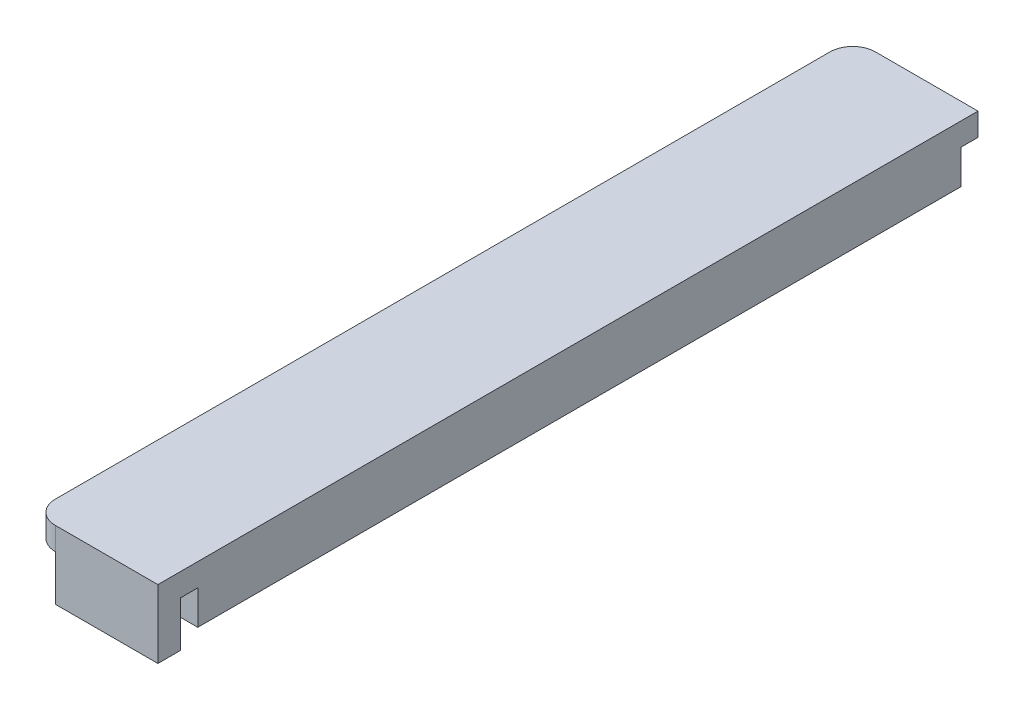
ISO-10303-21;
HEADER;
FILE_DESCRIPTION(('STEP AP214'),'2;1');
FILE_NAME('part.step','',(''),(''),'','','');
FILE_SCHEMA(('AUTOMOTIVE_DESIGN { 1 0 10303 214 1 1 1 1 }'));
ENDSEC;
DATA;
#1=APPLICATION_CONTEXT('core data for automotive mechanical design processes');
#2=APPLICATION_PROTOCOL_DEFINITION('international standard','automotive_design',2000,#1);
#3=PRODUCT_CONTEXT('',#1,'mechanical');
#4=PRODUCT('Part','Part','',(#3));
#5=PRODUCT_RELATED_PRODUCT_CATEGORY('part','',(#4));
#6=PRODUCT_DEFINITION_FORMATION('','',#4);
#7=PRODUCT_DEFINITION_CONTEXT('part definition',#1,'design');
#8=PRODUCT_DEFINITION('design','',#6,#7);
#9=PRODUCT_DEFINITION_SHAPE('','',#8);
#10=(LENGTH_UNIT() NAMED_UNIT(*) SI_UNIT(.MILLI.,.METRE.));
#11=(NAMED_UNIT(*) PLANE_ANGLE_UNIT() SI_UNIT($,.RADIAN.));
#12=(NAMED_UNIT(*) SI_UNIT($,.STERADIAN.) SOLID_ANGLE_UNIT());
#13=UNCERTAINTY_MEASURE_WITH_UNIT(LENGTH_MEASURE(1.E-05),#10,'distance_accuracy_value','');
#14=(GEOMETRIC_REPRESENTATION_CONTEXT(3) GLOBAL_UNCERTAINTY_ASSIGNED_CONTEXT((#13)) GLOBAL_UNIT_ASSIGNED_CONTEXT((#10,
#11,#12)) REPRESENTATION_CONTEXT('',''));
#15=CARTESIAN_POINT('',(0.,0.,0.));
#16=DIRECTION('',(0.,0.,1.));
#17=DIRECTION('',(1.,0.,0.));
#18=AXIS2_PLACEMENT_3D('',#15,#16,#17);
#19=CARTESIAN_POINT('',(-3.5,0.,35.));
#20=DIRECTION('',(0.,1.,0.));
#21=DIRECTION('',(0.,0.,1.));
#22=AXIS2_PLACEMENT_3D('',#19,#20,#21);
#23=PLANE('',#22);
#24=DIRECTION('',(0.,0.,1.));
#25=VECTOR('',#24,1.);
#26=CARTESIAN_POINT('',(-5.50000000000001,0.,-35.));
#27=LINE('',#26,#25);
#28=CARTESIAN_POINT('',(-5.50000000000001,0.,-33.));
#29=VERTEX_POINT('',#28);
#30=CARTESIAN_POINT('',(-5.5,0.,35.));
#31=VERTEX_POINT('',#30);
#32=EDGE_CURVE('E163',#29,#31,#27,.T.);
#33=ORIENTED_EDGE('',*,*,#32,.F.);
#34=CARTESIAN_POINT('',(-3.50000000000001,0.,-33.));
#35=DIRECTION('',(0.,1.,0.));
#36=DIRECTION('',(0.,0.,1.));
#37=AXIS2_PLACEMENT_3D('',#34,#35,#36);
#38=CIRCLE('',#37,2.);
#39=CARTESIAN_POINT('',(-3.50000000000001,0.,-35.));
#40=VERTEX_POINT('',#39);
#41=EDGE_CURVE('E65',#29,#40,#38,.F.);
#42=ORIENTED_EDGE('',*,*,#41,.T.);
#43=DIRECTION('',(-1.,0.,0.));
#44=VECTOR('',#43,1.);
#45=CARTESIAN_POINT('',(-3.49999999999999,0.,-35.));
#46=LINE('',#45,#44);
#47=CARTESIAN_POINT('',(5.49999999999999,0.,-35.));
#48=VERTEX_POINT('',#47);
#49=EDGE_CURVE('E236',#48,#40,#46,.T.);
#50=ORIENTED_EDGE('',*,*,#49,.F.);
#51=DIRECTION('',(0.,0.,-1.));
#52=VECTOR('',#51,1.);
#53=CARTESIAN_POINT('',(5.49999999999999,0.,-37.));
#54=LINE('',#53,#52);
#55=CARTESIAN_POINT('',(5.49999999999999,0.,-33.5));
#56=VERTEX_POINT('',#55);
#57=EDGE_CURVE('E147',#56,#48,#54,.T.);
#58=ORIENTED_EDGE('',*,*,#57,.F.);
#59=DIRECTION('',(1.,0.,0.));
#60=VECTOR('',#59,1.);
#61=CARTESIAN_POINT('',(5.50000000000001,0.,-33.5));
#62=LINE('',#61,#60);
#63=CARTESIAN_POINT('',(-4.,0.,-33.5));
#64=VERTEX_POINT('',#63);
#65=EDGE_CURVE('E263',#64,#56,#62,.T.);
#66=ORIENTED_EDGE('',*,*,#65,.F.);
#67=DIRECTION('',(0.,0.,-1.));
#68=VECTOR('',#67,1.);
#69=CARTESIAN_POINT('',(-4.,0.,33.5));
#70=LINE('',#69,#68);
#71=CARTESIAN_POINT('',(-4.,0.,33.5));
#72=VERTEX_POINT('',#71);
#73=EDGE_CURVE('E268',#72,#64,#70,.T.);
#74=ORIENTED_EDGE('',*,*,#73,.F.);
#75=DIRECTION('',(-1.,0.,0.));
#76=VECTOR('',#75,1.);
#77=CARTESIAN_POINT('',(5.5,0.,33.5));
#78=LINE('',#77,#76);
#79=CARTESIAN_POINT('',(5.5,0.,33.5));
#80=VERTEX_POINT('',#79);
#81=EDGE_CURVE('E140',#80,#72,#78,.T.);
#82=ORIENTED_EDGE('',*,*,#81,.F.);
#83=CARTESIAN_POINT('',(5.5,0.,35.));
#84=VERTEX_POINT('',#83);
#85=EDGE_CURVE('E174',#84,#80,#54,.T.);
#86=ORIENTED_EDGE('',*,*,#85,.F.);
#87=DIRECTION('',(1.,0.,0.));
#88=VECTOR('',#87,1.);
#89=CARTESIAN_POINT('',(-3.49999999999998,0.,35.));
#90=LINE('',#89,#88);
#91=CARTESIAN_POINT('',(-3.49999999999998,0.,35.));
#92=VERTEX_POINT('',#91);
#93=EDGE_CURVE('E231',#92,#84,#90,.T.);
#94=ORIENTED_EDGE('',*,*,#93,.F.);
#95=DIRECTION('',(0.,0.,-1.));
#96=VECTOR('',#95,1.);
#97=CARTESIAN_POINT('',(-3.49999999999998,0.,37.));
#98=LINE('',#97,#96);
#99=CARTESIAN_POINT('',(-3.49999999999998,0.,37.));
#100=VERTEX_POINT('',#99);
#101=EDGE_CURVE('E204',#100,#92,#98,.T.);
#102=ORIENTED_EDGE('',*,*,#101,.F.);
#103=CARTESIAN_POINT('',(-3.5,0.,35.));
#104=DIRECTION('',(0.,1.,0.));
#105=DIRECTION('',(0.,0.,1.));
#106=AXIS2_PLACEMENT_3D('',#103,#104,#105);
#107=CIRCLE('',#106,2.);
#108=EDGE_CURVE('E156',#31,#100,#107,.T.);
#109=ORIENTED_EDGE('',*,*,#108,.F.);
#110=EDGE_LOOP('',(#33,#42,#50,#58,#66,#74,#82,#86,#94,#102,#109));
#111=FACE_BOUND('',#110,.T.);
#112=ADVANCED_FACE('F42',(#111),#23,.F.);
#113=CARTESIAN_POINT('',(5.49999999999999,2.,-37.));
#114=DIRECTION('',(-1.,0.,0.));
#115=DIRECTION('',(0.,0.,1.));
#116=AXIS2_PLACEMENT_3D('',#113,#114,#115);
#117=PLANE('',#116);
#118=ORIENTED_EDGE('',*,*,#57,.T.);
#119=DIRECTION('',(0.,-1.,0.));
#120=VECTOR('',#119,1.);
#121=CARTESIAN_POINT('',(5.49999999999999,6.,-35.));
#122=LINE('',#121,#120);
#123=CARTESIAN_POINT('',(5.49999999999999,2.,-35.));
#124=VERTEX_POINT('',#123);
#125=EDGE_CURVE('E134',#124,#48,#122,.T.);
#126=ORIENTED_EDGE('',*,*,#125,.F.);
#127=DIRECTION('',(0.,0.,-1.));
#128=VECTOR('',#127,1.);
#129=CARTESIAN_POINT('',(5.49999999999999,2.,-37.));
#130=LINE('',#129,#128);
#131=CARTESIAN_POINT('',(5.5,2.,37.));
#132=VERTEX_POINT('',#131);
#133=EDGE_CURVE('E145',#132,#124,#130,.T.);
#134=ORIENTED_EDGE('',*,*,#133,.F.);
#135=DIRECTION('',(0.,-1.,0.));
#136=VECTOR('',#135,1.);
#137=CARTESIAN_POINT('',(5.5,2.,37.));
#138=LINE('',#137,#136);
#139=CARTESIAN_POINT('',(5.5,-4.,37.));
#140=VERTEX_POINT('',#139);
#141=EDGE_CURVE('E173',#132,#140,#138,.T.);
#142=ORIENTED_EDGE('',*,*,#141,.T.);
#143=DIRECTION('',(0.,0.,1.));
#144=VECTOR('',#143,1.);
#145=CARTESIAN_POINT('',(5.5,-4.,37.));
#146=LINE('',#145,#144);
#147=CARTESIAN_POINT('',(5.5,-4.,35.));
#148=VERTEX_POINT('',#147);
#149=EDGE_CURVE('E228',#148,#140,#146,.T.);
#150=ORIENTED_EDGE('',*,*,#149,.F.);
#151=DIRECTION('',(0.,1.,0.));
#152=VECTOR('',#151,1.);
#153=CARTESIAN_POINT('',(5.5,-4.,35.));
#154=LINE('',#153,#152);
#155=EDGE_CURVE('E222',#148,#84,#154,.T.);
#156=ORIENTED_EDGE('',*,*,#155,.T.);
#157=ORIENTED_EDGE('',*,*,#85,.T.);
#158=DIRECTION('',(0.,1.,0.));
#159=VECTOR('',#158,1.);
#160=CARTESIAN_POINT('',(5.5,-3.,33.5));
#161=LINE('',#160,#159);
#162=CARTESIAN_POINT('',(5.5,-3.,33.5));
#163=VERTEX_POINT('',#162);
#164=EDGE_CURVE('E248',#163,#80,#161,.T.);
#165=ORIENTED_EDGE('',*,*,#164,.F.);
#166=DIRECTION('',(0.,0.,1.));
#167=VECTOR('',#166,1.);
#168=CARTESIAN_POINT('',(5.5,-3.,33.5));
#169=LINE('',#168,#167);
#170=CARTESIAN_POINT('',(5.50000000000001,-3.,-33.5));
#171=VERTEX_POINT('',#170);
#172=EDGE_CURVE('E267',#171,#163,#169,.T.);
#173=ORIENTED_EDGE('',*,*,#172,.F.);
#174=DIRECTION('',(0.,1.,0.));
#175=VECTOR('',#174,1.);
#176=CARTESIAN_POINT('',(5.50000000000001,-3.,-33.5));
#177=LINE('',#176,#175);
#178=EDGE_CURVE('E259',#171,#56,#177,.T.);
#179=ORIENTED_EDGE('',*,*,#178,.T.);
#180=EDGE_LOOP('',(#118,#126,#134,#142,#150,#156,#157,#165,#173,#179));
#181=FACE_BOUND('',#180,.T.);
#182=ADVANCED_FACE('F144',(#181),#117,.F.);
#183=CARTESIAN_POINT('',(-5.50000000000001,2.,-35.));
#184=DIRECTION('',(1.,0.,0.));
#185=DIRECTION('',(0.,0.,-1.));
#186=AXIS2_PLACEMENT_3D('',#183,#184,#185);
#187=PLANE('',#186);
#188=DIRECTION('',(0.,0.,1.));
#189=VECTOR('',#188,1.);
#190=CARTESIAN_POINT('',(-5.50000000000001,2.,-35.));
#191=LINE('',#190,#189);
#192=CARTESIAN_POINT('',(-5.50000000000001,2.,-33.));
#193=VERTEX_POINT('',#192);
#194=CARTESIAN_POINT('',(-5.5,2.,35.));
#195=VERTEX_POINT('',#194);
#196=EDGE_CURVE('E155',#193,#195,#191,.T.);
#197=ORIENTED_EDGE('',*,*,#196,.F.);
#198=DIRECTION('',(0.,-1.,0.));
#199=VECTOR('',#198,1.);
#200=CARTESIAN_POINT('',(-5.50000000000001,2.,-33.));
#201=LINE('',#200,#199);
#202=EDGE_CURVE('E190',#193,#29,#201,.T.);
#203=ORIENTED_EDGE('',*,*,#202,.T.);
#204=ORIENTED_EDGE('',*,*,#32,.T.);
#205=DIRECTION('',(0.,-1.,0.));
#206=VECTOR('',#205,1.);
#207=CARTESIAN_POINT('',(-5.5,2.,35.));
#208=LINE('',#207,#206);
#209=EDGE_CURVE('E186',#195,#31,#208,.T.);
#210=ORIENTED_EDGE('',*,*,#209,.F.);
#211=EDGE_LOOP('',(#197,#203,#204,#210));
#212=FACE_BOUND('',#211,.T.);
#213=ADVANCED_FACE('F199',(#212),#187,.F.);
#214=CARTESIAN_POINT('',(-3.5,2.,35.));
#215=DIRECTION('',(0.,-1.,0.));
#216=DIRECTION('',(0.,0.,-1.));
#217=AXIS2_PLACEMENT_3D('',#214,#215,#216);
#218=CYLINDRICAL_SURFACE('',#217,2.);
#219=ORIENTED_EDGE('',*,*,#108,.T.);
#220=DIRECTION('',(0.,-1.,0.));
#221=VECTOR('',#220,1.);
#222=CARTESIAN_POINT('',(-3.49999999999998,2.,37.));
#223=LINE('',#222,#221);
#224=CARTESIAN_POINT('',(-3.49999999999998,2.,37.));
#225=VERTEX_POINT('',#224);
#226=EDGE_CURVE('E182',#225,#100,#223,.T.);
#227=ORIENTED_EDGE('',*,*,#226,.F.);
#228=CARTESIAN_POINT('',(-3.5,2.,35.));
#229=DIRECTION('',(0.,1.,0.));
#230=DIRECTION('',(0.,0.,1.));
#231=AXIS2_PLACEMENT_3D('',#228,#229,#230);
#232=CIRCLE('',#231,2.);
#233=EDGE_CURVE('E160',#195,#225,#232,.T.);
#234=ORIENTED_EDGE('',*,*,#233,.F.);
#235=ORIENTED_EDGE('',*,*,#209,.T.);
#236=EDGE_LOOP('',(#219,#227,#234,#235));
#237=FACE_BOUND('',#236,.T.);
#238=ADVANCED_FACE('F207',(#237),#218,.T.);
#239=CARTESIAN_POINT('',(-3.49999999999998,2.,37.));
#240=DIRECTION('',(0.,0.,-1.));
#241=DIRECTION('',(-1.,0.,0.));
#242=AXIS2_PLACEMENT_3D('',#239,#240,#241);
#243=PLANE('',#242);
#244=ORIENTED_EDGE('',*,*,#226,.T.);
#245=DIRECTION('',(0.,1.,0.));
#246=VECTOR('',#245,1.);
#247=CARTESIAN_POINT('',(-3.49999999999998,-4.,37.));
#248=LINE('',#247,#246);
#249=CARTESIAN_POINT('',(-3.49999999999998,-4.,37.));
#250=VERTEX_POINT('',#249);
#251=EDGE_CURVE('E214',#250,#100,#248,.T.);
#252=ORIENTED_EDGE('',*,*,#251,.F.);
#253=DIRECTION('',(-1.,0.,0.));
#254=VECTOR('',#253,1.);
#255=CARTESIAN_POINT('',(-3.49999999999998,-4.,37.));
#256=LINE('',#255,#254);
#257=EDGE_CURVE('E223',#140,#250,#256,.T.);
#258=ORIENTED_EDGE('',*,*,#257,.F.);
#259=ORIENTED_EDGE('',*,*,#141,.F.);
#260=DIRECTION('',(1.,0.,0.));
#261=VECTOR('',#260,1.);
#262=CARTESIAN_POINT('',(-3.49999999999998,2.,37.));
#263=LINE('',#262,#261);
#264=EDGE_CURVE('E152',#225,#132,#263,.T.);
#265=ORIENTED_EDGE('',*,*,#264,.F.);
#266=EDGE_LOOP('',(#244,#252,#258,#259,#265));
#267=FACE_BOUND('',#266,.T.);
#268=ADVANCED_FACE('F212',(#267),#243,.F.);
#269=CARTESIAN_POINT('',(-3.5,2.,35.));
#270=DIRECTION('',(0.,1.,0.));
#271=DIRECTION('',(0.,0.,1.));
#272=AXIS2_PLACEMENT_3D('',#269,#270,#271);
#273=PLANE('',#272);
#274=DIRECTION('',(1.,0.,0.));
#275=VECTOR('',#274,1.);
#276=CARTESIAN_POINT('',(-3.5,2.,-35.));
#277=LINE('',#276,#275);
#278=CARTESIAN_POINT('',(-3.50000000000001,2.,-35.));
#279=VERTEX_POINT('',#278);
#280=EDGE_CURVE('E131',#279,#124,#277,.T.);
#281=ORIENTED_EDGE('',*,*,#280,.F.);
#282=CARTESIAN_POINT('',(-3.50000000000001,2.,-33.));
#283=DIRECTION('',(0.,1.,0.));
#284=DIRECTION('',(0.,0.,1.));
#285=AXIS2_PLACEMENT_3D('',#282,#283,#284);
#286=CIRCLE('',#285,2.);
#287=EDGE_CURVE('E11',#279,#193,#286,.T.);
#288=ORIENTED_EDGE('',*,*,#287,.T.);
#289=ORIENTED_EDGE('',*,*,#196,.T.);
#290=ORIENTED_EDGE('',*,*,#233,.T.);
#291=ORIENTED_EDGE('',*,*,#264,.T.);
#292=ORIENTED_EDGE('',*,*,#133,.T.);
#293=EDGE_LOOP('',(#281,#288,#289,#290,#291,#292));
#294=FACE_BOUND('',#293,.T.);
#295=ADVANCED_FACE('F150',(#294),#273,.T.);
#296=CARTESIAN_POINT('',(-3.49999999999998,-4.,37.));
#297=DIRECTION('',(1.,0.,0.));
#298=DIRECTION('',(0.,0.,-1.));
#299=AXIS2_PLACEMENT_3D('',#296,#297,#298);
#300=PLANE('',#299);
#301=ORIENTED_EDGE('',*,*,#101,.T.);
#302=DIRECTION('',(0.,1.,0.));
#303=VECTOR('',#302,1.);
#304=CARTESIAN_POINT('',(-3.49999999999998,-4.,35.));
#305=LINE('',#304,#303);
#306=CARTESIAN_POINT('',(-3.49999999999998,-4.,35.));
#307=VERTEX_POINT('',#306);
#308=EDGE_CURVE('E166',#307,#92,#305,.T.);
#309=ORIENTED_EDGE('',*,*,#308,.F.);
#310=DIRECTION('',(0.,0.,-1.));
#311=VECTOR('',#310,1.);
#312=CARTESIAN_POINT('',(-3.49999999999998,-4.,37.));
#313=LINE('',#312,#311);
#314=EDGE_CURVE('E220',#250,#307,#313,.T.);
#315=ORIENTED_EDGE('',*,*,#314,.F.);
#316=ORIENTED_EDGE('',*,*,#251,.T.);
#317=EDGE_LOOP('',(#301,#309,#315,#316));
#318=FACE_BOUND('',#317,.T.);
#319=ADVANCED_FACE('F217',(#318),#300,.F.);
#320=CARTESIAN_POINT('',(-3.49999999999998,-4.,35.));
#321=DIRECTION('',(0.,0.,1.));
#322=DIRECTION('',(1.,0.,0.));
#323=AXIS2_PLACEMENT_3D('',#320,#321,#322);
#324=PLANE('',#323);
#325=ORIENTED_EDGE('',*,*,#93,.T.);
#326=ORIENTED_EDGE('',*,*,#155,.F.);
#327=DIRECTION('',(1.,0.,0.));
#328=VECTOR('',#327,1.);
#329=CARTESIAN_POINT('',(-3.49999999999998,-4.,35.));
#330=LINE('',#329,#328);
#331=EDGE_CURVE('E241',#307,#148,#330,.T.);
#332=ORIENTED_EDGE('',*,*,#331,.F.);
#333=ORIENTED_EDGE('',*,*,#308,.T.);
#334=EDGE_LOOP('',(#325,#326,#332,#333));
#335=FACE_BOUND('',#334,.T.);
#336=ADVANCED_FACE('F305',(#335),#324,.F.);
#337=CARTESIAN_POINT('',(0.,-4.,0.));
#338=DIRECTION('',(0.,-1.,0.));
#339=DIRECTION('',(0.,0.,-1.));
#340=AXIS2_PLACEMENT_3D('',#337,#338,#339);
#341=PLANE('',#340);
#342=ORIENTED_EDGE('',*,*,#314,.T.);
#343=ORIENTED_EDGE('',*,*,#331,.T.);
#344=ORIENTED_EDGE('',*,*,#149,.T.);
#345=ORIENTED_EDGE('',*,*,#257,.T.);
#346=EDGE_LOOP('',(#342,#343,#344,#345));
#347=FACE_BOUND('',#346,.T.);
#348=ADVANCED_FACE('F309',(#347),#341,.T.);
#349=CARTESIAN_POINT('',(5.5,-3.,33.5));
#350=DIRECTION('',(0.,0.,-1.));
#351=DIRECTION('',(-1.,0.,0.));
#352=AXIS2_PLACEMENT_3D('',#349,#350,#351);
#353=PLANE('',#352);
#354=ORIENTED_EDGE('',*,*,#81,.T.);
#355=DIRECTION('',(0.,1.,0.));
#356=VECTOR('',#355,1.);
#357=CARTESIAN_POINT('',(-4.,-3.,33.5));
#358=LINE('',#357,#356);
#359=CARTESIAN_POINT('',(-4.,-3.,33.5));
#360=VERTEX_POINT('',#359);
#361=EDGE_CURVE('E251',#360,#72,#358,.T.);
#362=ORIENTED_EDGE('',*,*,#361,.F.);
#363=DIRECTION('',(-1.,0.,0.));
#364=VECTOR('',#363,1.);
#365=CARTESIAN_POINT('',(5.5,-3.,33.5));
#366=LINE('',#365,#364);
#367=EDGE_CURVE('E278',#163,#360,#366,.T.);
#368=ORIENTED_EDGE('',*,*,#367,.F.);
#369=ORIENTED_EDGE('',*,*,#164,.T.);
#370=EDGE_LOOP('',(#354,#362,#368,#369));
#371=FACE_BOUND('',#370,.T.);
#372=ADVANCED_FACE('F292',(#371),#353,.F.);
#373=CARTESIAN_POINT('',(-4.,-3.,33.5));
#374=DIRECTION('',(1.,0.,0.));
#375=DIRECTION('',(0.,0.,-1.));
#376=AXIS2_PLACEMENT_3D('',#373,#374,#375);
#377=PLANE('',#376);
#378=ORIENTED_EDGE('',*,*,#73,.T.);
#379=DIRECTION('',(0.,1.,0.));
#380=VECTOR('',#379,1.);
#381=CARTESIAN_POINT('',(-4.,-3.,-33.5));
#382=LINE('',#381,#380);
#383=CARTESIAN_POINT('',(-4.,-3.,-33.5));
#384=VERTEX_POINT('',#383);
#385=EDGE_CURVE('E255',#384,#64,#382,.T.);
#386=ORIENTED_EDGE('',*,*,#385,.F.);
#387=DIRECTION('',(0.,0.,-1.));
#388=VECTOR('',#387,1.);
#389=CARTESIAN_POINT('',(-4.,-3.,33.5));
#390=LINE('',#389,#388);
#391=EDGE_CURVE('E275',#360,#384,#390,.T.);
#392=ORIENTED_EDGE('',*,*,#391,.F.);
#393=ORIENTED_EDGE('',*,*,#361,.T.);
#394=EDGE_LOOP('',(#378,#386,#392,#393));
#395=FACE_BOUND('',#394,.T.);
#396=ADVANCED_FACE('F297',(#395),#377,.F.);
#397=CARTESIAN_POINT('',(5.50000000000001,-3.,-33.5));
#398=DIRECTION('',(0.,0.,1.));
#399=DIRECTION('',(1.,0.,0.));
#400=AXIS2_PLACEMENT_3D('',#397,#398,#399);
#401=PLANE('',#400);
#402=ORIENTED_EDGE('',*,*,#65,.T.);
#403=ORIENTED_EDGE('',*,*,#178,.F.);
#404=DIRECTION('',(1.,0.,0.));
#405=VECTOR('',#404,1.);
#406=CARTESIAN_POINT('',(5.50000000000001,-3.,-33.5));
#407=LINE('',#406,#405);
#408=EDGE_CURVE('E262',#384,#171,#407,.T.);
#409=ORIENTED_EDGE('',*,*,#408,.F.);
#410=ORIENTED_EDGE('',*,*,#385,.T.);
#411=EDGE_LOOP('',(#402,#403,#409,#410));
#412=FACE_BOUND('',#411,.T.);
#413=ADVANCED_FACE('F300',(#412),#401,.F.);
#414=CARTESIAN_POINT('',(0.,-3.,0.));
#415=DIRECTION('',(0.,1.,0.));
#416=DIRECTION('',(0.,0.,1.));
#417=AXIS2_PLACEMENT_3D('',#414,#415,#416);
#418=PLANE('',#417);
#419=ORIENTED_EDGE('',*,*,#172,.T.);
#420=ORIENTED_EDGE('',*,*,#367,.T.);
#421=ORIENTED_EDGE('',*,*,#391,.T.);
#422=ORIENTED_EDGE('',*,*,#408,.T.);
#423=EDGE_LOOP('',(#419,#420,#421,#422));
#424=FACE_BOUND('',#423,.T.);
#425=ADVANCED_FACE('F286',(#424),#418,.F.);
#426=CARTESIAN_POINT('',(5.49999999999999,6.,-35.));
#427=DIRECTION('',(0.,0.,1.));
#428=DIRECTION('',(1.,0.,0.));
#429=AXIS2_PLACEMENT_3D('',#426,#427,#428);
#430=PLANE('',#429);
#431=ORIENTED_EDGE('',*,*,#49,.T.);
#432=DIRECTION('',(0.,-1.,0.));
#433=VECTOR('',#432,1.);
#434=CARTESIAN_POINT('',(-3.50000000000001,6.,-35.));
#435=LINE('',#434,#433);
#436=EDGE_CURVE('E51',#40,#279,#435,.F.);
#437=ORIENTED_EDGE('',*,*,#436,.T.);
#438=ORIENTED_EDGE('',*,*,#280,.T.);
#439=ORIENTED_EDGE('',*,*,#125,.T.);
#440=EDGE_LOOP('',(#431,#437,#438,#439));
#441=FACE_BOUND('',#440,.T.);
#442=ADVANCED_FACE('F133',(#441),#430,.F.);
#443=CARTESIAN_POINT('',(-3.50000000000001,2.,-33.));
#444=DIRECTION('',(0.,-1.,0.));
#445=DIRECTION('',(0.,0.,-1.));
#446=AXIS2_PLACEMENT_3D('',#443,#444,#445);
#447=CYLINDRICAL_SURFACE('',#446,2.);
#448=ORIENTED_EDGE('',*,*,#287,.F.);
#449=ORIENTED_EDGE('',*,*,#436,.F.);
#450=ORIENTED_EDGE('',*,*,#41,.F.);
#451=ORIENTED_EDGE('',*,*,#202,.F.);
#452=EDGE_LOOP('',(#448,#449,#450,#451));
#453=FACE_BOUND('',#452,.T.);
#454=ADVANCED_FACE('F44',(#453),#447,.T.);
#455=CLOSED_SHELL('',(#112,#182,#213,#238,#268,#295,#319,#336,#348,#372,#396,#413,#425,#442,#454));
#456=MANIFOLD_SOLID_BREP('B2',#455);
#457=ADVANCED_BREP_SHAPE_REPRESENTATION('',(#18,#456),#14);
#458=SHAPE_DEFINITION_REPRESENTATION(#9,#457);
ENDSEC;
END-ISO-10303-21;
